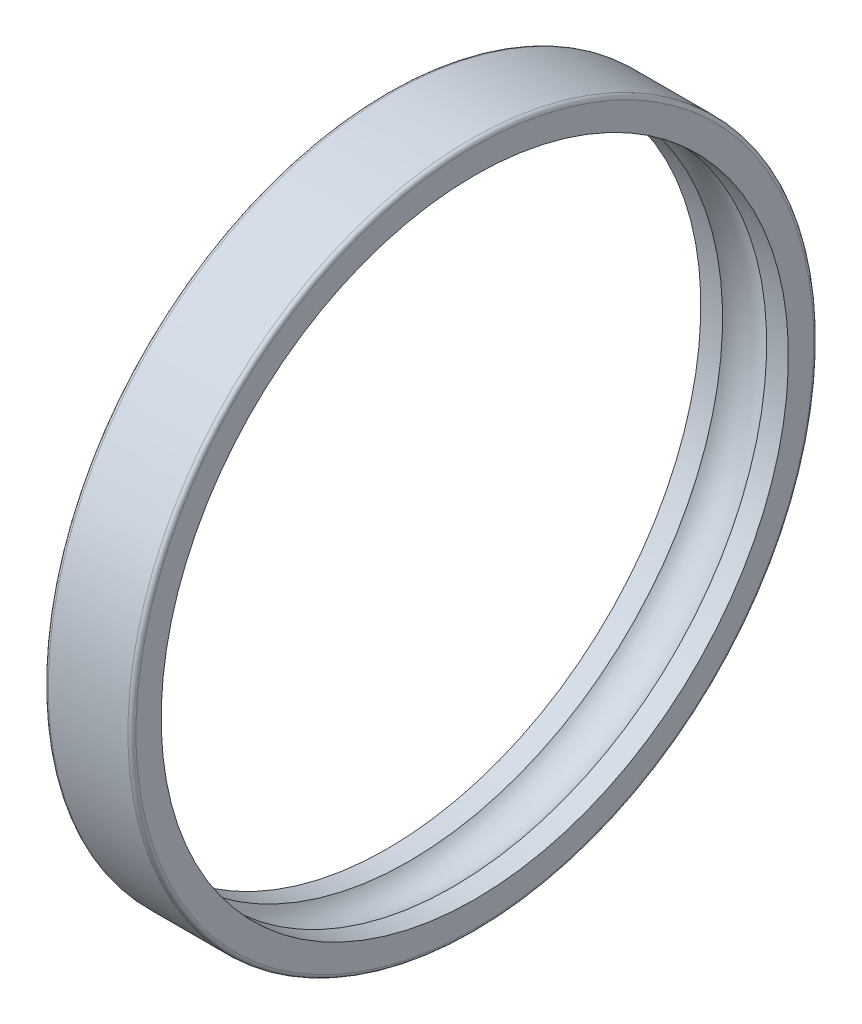
ISO-10303-21;
HEADER;
FILE_DESCRIPTION(('STEP AP214'),'2;1');
FILE_NAME('part.step','',(''),(''),'','','');
FILE_SCHEMA(('AUTOMOTIVE_DESIGN { 1 0 10303 214 1 1 1 1 }'));
ENDSEC;
DATA;
#1=APPLICATION_CONTEXT('core data for automotive mechanical design processes');
#2=APPLICATION_PROTOCOL_DEFINITION('international standard','automotive_design',2000,#1);
#3=PRODUCT_CONTEXT('',#1,'mechanical');
#4=PRODUCT('Part','Part','',(#3));
#5=PRODUCT_RELATED_PRODUCT_CATEGORY('part','',(#4));
#6=PRODUCT_DEFINITION_FORMATION('','',#4);
#7=PRODUCT_DEFINITION_CONTEXT('part definition',#1,'design');
#8=PRODUCT_DEFINITION('design','',#6,#7);
#9=PRODUCT_DEFINITION_SHAPE('','',#8);
#10=(LENGTH_UNIT() NAMED_UNIT(*) SI_UNIT(.MILLI.,.METRE.));
#11=(NAMED_UNIT(*) PLANE_ANGLE_UNIT() SI_UNIT($,.RADIAN.));
#12=(NAMED_UNIT(*) SI_UNIT($,.STERADIAN.) SOLID_ANGLE_UNIT());
#13=UNCERTAINTY_MEASURE_WITH_UNIT(LENGTH_MEASURE(1.E-05),#10,'distance_accuracy_value','');
#14=(GEOMETRIC_REPRESENTATION_CONTEXT(3) GLOBAL_UNCERTAINTY_ASSIGNED_CONTEXT((#13)) GLOBAL_UNIT_ASSIGNED_CONTEXT((#10,
#11,#12)) REPRESENTATION_CONTEXT('',''));
#15=CARTESIAN_POINT('',(0.,0.,0.));
#16=DIRECTION('',(0.,0.,1.));
#17=DIRECTION('',(1.,0.,0.));
#18=AXIS2_PLACEMENT_3D('',#15,#16,#17);
#19=CARTESIAN_POINT('',(40.2946971663754,0.,0.));
#20=DIRECTION('',(-1.,0.,0.));
#21=DIRECTION('',(0.,1.,0.));
#22=AXIS2_PLACEMENT_3D('',#19,#20,#21);
#23=CYLINDRICAL_SURFACE('',#22,164.65);
#24=CARTESIAN_POINT('',(46.,0.,0.));
#25=DIRECTION('',(1.,0.,0.));
#26=DIRECTION('',(0.,1.,0.));
#27=AXIS2_PLACEMENT_3D('',#24,#25,#26);
#28=CIRCLE('',#27,164.65);
#29=CARTESIAN_POINT('',(46.,164.65,0.));
#30=VERTEX_POINT('',#29);
#31=EDGE_CURVE('E11',#30,#30,#28,.T.);
#32=ORIENTED_EDGE('',*,*,#31,.T.);
#33=EDGE_LOOP('',(#32));
#34=FACE_BOUND('',#33,.T.);
#35=CARTESIAN_POINT('',(34.5893943327509,0.,0.));
#36=DIRECTION('',(1.,0.,0.));
#37=DIRECTION('',(0.,1.,0.));
#38=AXIS2_PLACEMENT_3D('',#35,#36,#37);
#39=CIRCLE('',#38,164.65);
#40=CARTESIAN_POINT('',(34.5893943327509,164.65,0.));
#41=VERTEX_POINT('',#40);
#42=EDGE_CURVE('E46',#41,#41,#39,.T.);
#43=ORIENTED_EDGE('',*,*,#42,.F.);
#44=EDGE_LOOP('',(#43));
#45=FACE_BOUND('',#44,.T.);
#46=ADVANCED_FACE('F17',(#34,#45),#23,.F.);
#47=CARTESIAN_POINT('',(46.,171.275,0.));
#48=DIRECTION('',(1.,0.,0.));
#49=DIRECTION('',(0.,1.,0.));
#50=AXIS2_PLACEMENT_3D('',#47,#48,#49);
#51=PLANE('',#50);
#52=CARTESIAN_POINT('',(46.,0.,0.));
#53=DIRECTION('',(1.,0.,0.));
#54=DIRECTION('',(0.,1.,0.));
#55=AXIS2_PLACEMENT_3D('',#52,#53,#54);
#56=CIRCLE('',#55,177.9);
#57=CARTESIAN_POINT('',(46.,177.9,0.));
#58=VERTEX_POINT('',#57);
#59=EDGE_CURVE('E21',#58,#58,#56,.T.);
#60=ORIENTED_EDGE('',*,*,#59,.T.);
#61=EDGE_LOOP('',(#60));
#62=FACE_BOUND('',#61,.T.);
#63=ORIENTED_EDGE('',*,*,#31,.F.);
#64=EDGE_LOOP('',(#63));
#65=FACE_BOUND('',#64,.T.);
#66=ADVANCED_FACE('F70',(#62,#65),#51,.T.);
#67=CARTESIAN_POINT('',(43.9,0.,0.));
#68=DIRECTION('',(1.,0.,0.));
#69=DIRECTION('',(0.,0.,-1.));
#70=AXIS2_PLACEMENT_3D('',#67,#68,#69);
#71=TOROIDAL_SURFACE('',#70,177.9,2.1);
#72=CARTESIAN_POINT('',(43.9,0.,0.));
#73=DIRECTION('',(1.,0.,0.));
#74=DIRECTION('',(0.,1.,0.));
#75=AXIS2_PLACEMENT_3D('',#72,#73,#74);
#76=CIRCLE('',#75,180.);
#77=CARTESIAN_POINT('',(43.9,180.,0.));
#78=VERTEX_POINT('',#77);
#79=EDGE_CURVE('E61',#78,#78,#76,.T.);
#80=ORIENTED_EDGE('',*,*,#79,.T.);
#81=EDGE_LOOP('',(#80));
#82=FACE_BOUND('',#81,.T.);
#83=ORIENTED_EDGE('',*,*,#59,.F.);
#84=EDGE_LOOP('',(#83));
#85=FACE_BOUND('',#84,.T.);
#86=ADVANCED_FACE('F73',(#82,#85),#71,.T.);
#87=CARTESIAN_POINT('',(23.,0.,0.));
#88=DIRECTION('',(-1.,0.,0.));
#89=DIRECTION('',(0.,1.,0.));
#90=AXIS2_PLACEMENT_3D('',#87,#88,#89);
#91=CYLINDRICAL_SURFACE('',#90,180.);
#92=CARTESIAN_POINT('',(2.1,0.,0.));
#93=DIRECTION('',(1.,0.,0.));
#94=DIRECTION('',(0.,1.,0.));
#95=AXIS2_PLACEMENT_3D('',#92,#93,#94);
#96=CIRCLE('',#95,180.);
#97=CARTESIAN_POINT('',(2.1,180.,0.));
#98=VERTEX_POINT('',#97);
#99=EDGE_CURVE('E58',#98,#98,#96,.T.);
#100=ORIENTED_EDGE('',*,*,#99,.T.);
#101=EDGE_LOOP('',(#100));
#102=FACE_BOUND('',#101,.T.);
#103=ORIENTED_EDGE('',*,*,#79,.F.);
#104=EDGE_LOOP('',(#103));
#105=FACE_BOUND('',#104,.T.);
#106=ADVANCED_FACE('F75',(#102,#105),#91,.T.);
#107=CARTESIAN_POINT('',(2.1,0.,0.));
#108=DIRECTION('',(1.,0.,0.));
#109=DIRECTION('',(0.,0.,-1.));
#110=AXIS2_PLACEMENT_3D('',#107,#108,#109);
#111=TOROIDAL_SURFACE('',#110,177.9,2.1);
#112=CARTESIAN_POINT('',(0.,0.,0.));
#113=DIRECTION('',(1.,0.,0.));
#114=DIRECTION('',(0.,1.,0.));
#115=AXIS2_PLACEMENT_3D('',#112,#113,#114);
#116=CIRCLE('',#115,177.9);
#117=CARTESIAN_POINT('',(0.,177.9,0.));
#118=VERTEX_POINT('',#117);
#119=EDGE_CURVE('E62',#118,#118,#116,.T.);
#120=ORIENTED_EDGE('',*,*,#119,.T.);
#121=EDGE_LOOP('',(#120));
#122=FACE_BOUND('',#121,.T.);
#123=ORIENTED_EDGE('',*,*,#99,.F.);
#124=EDGE_LOOP('',(#123));
#125=FACE_BOUND('',#124,.T.);
#126=ADVANCED_FACE('F82',(#122,#125),#111,.T.);
#127=CARTESIAN_POINT('',(0.,171.275,0.));
#128=DIRECTION('',(-1.,0.,0.));
#129=DIRECTION('',(0.,-1.,0.));
#130=AXIS2_PLACEMENT_3D('',#127,#128,#129);
#131=PLANE('',#130);
#132=CARTESIAN_POINT('',(0.,0.,0.));
#133=DIRECTION('',(1.,0.,0.));
#134=DIRECTION('',(0.,1.,0.));
#135=AXIS2_PLACEMENT_3D('',#132,#133,#134);
#136=CIRCLE('',#135,164.65);
#137=CARTESIAN_POINT('',(0.,164.65,0.));
#138=VERTEX_POINT('',#137);
#139=EDGE_CURVE('E55',#138,#138,#136,.T.);
#140=ORIENTED_EDGE('',*,*,#139,.T.);
#141=EDGE_LOOP('',(#140));
#142=FACE_BOUND('',#141,.T.);
#143=ORIENTED_EDGE('',*,*,#119,.F.);
#144=EDGE_LOOP('',(#143));
#145=FACE_BOUND('',#144,.T.);
#146=ADVANCED_FACE('F120',(#142,#145),#131,.T.);
#147=CARTESIAN_POINT('',(5.70530283362454,0.,0.));
#148=DIRECTION('',(-1.,0.,0.));
#149=DIRECTION('',(0.,1.,0.));
#150=AXIS2_PLACEMENT_3D('',#147,#148,#149);
#151=CYLINDRICAL_SURFACE('',#150,164.65);
#152=CARTESIAN_POINT('',(11.4106056672491,0.,0.));
#153=DIRECTION('',(1.,0.,0.));
#154=DIRECTION('',(0.,1.,0.));
#155=AXIS2_PLACEMENT_3D('',#152,#153,#154);
#156=CIRCLE('',#155,164.65);
#157=CARTESIAN_POINT('',(11.4106056672491,164.65,0.));
#158=VERTEX_POINT('',#157);
#159=EDGE_CURVE('E52',#158,#158,#156,.T.);
#160=ORIENTED_EDGE('',*,*,#159,.T.);
#161=EDGE_LOOP('',(#160));
#162=FACE_BOUND('',#161,.T.);
#163=ORIENTED_EDGE('',*,*,#139,.F.);
#164=EDGE_LOOP('',(#163));
#165=FACE_BOUND('',#164,.T.);
#166=ADVANCED_FACE('F19',(#162,#165),#151,.F.);
#167=CARTESIAN_POINT('',(23.,0.,0.));
#168=DIRECTION('',(1.,0.,0.));
#169=DIRECTION('',(0.,0.,-1.));
#170=AXIS2_PLACEMENT_3D('',#167,#168,#169);
#171=TOROIDAL_SURFACE('',#170,155.,15.081);
#172=ORIENTED_EDGE('',*,*,#42,.T.);
#173=EDGE_LOOP('',(#172));
#174=FACE_BOUND('',#173,.T.);
#175=ORIENTED_EDGE('',*,*,#159,.F.);
#176=EDGE_LOOP('',(#175));
#177=FACE_BOUND('',#176,.T.);
#178=ADVANCED_FACE('F137',(#174,#177),#171,.F.);
#179=CLOSED_SHELL('',(#46,#66,#86,#106,#126,#146,#166,#178));
#180=MANIFOLD_SOLID_BREP('B1',#179);
#181=ADVANCED_BREP_SHAPE_REPRESENTATION('',(#18,#180),#14);
#182=SHAPE_DEFINITION_REPRESENTATION(#9,#181);
ENDSEC;
END-ISO-10303-21;
